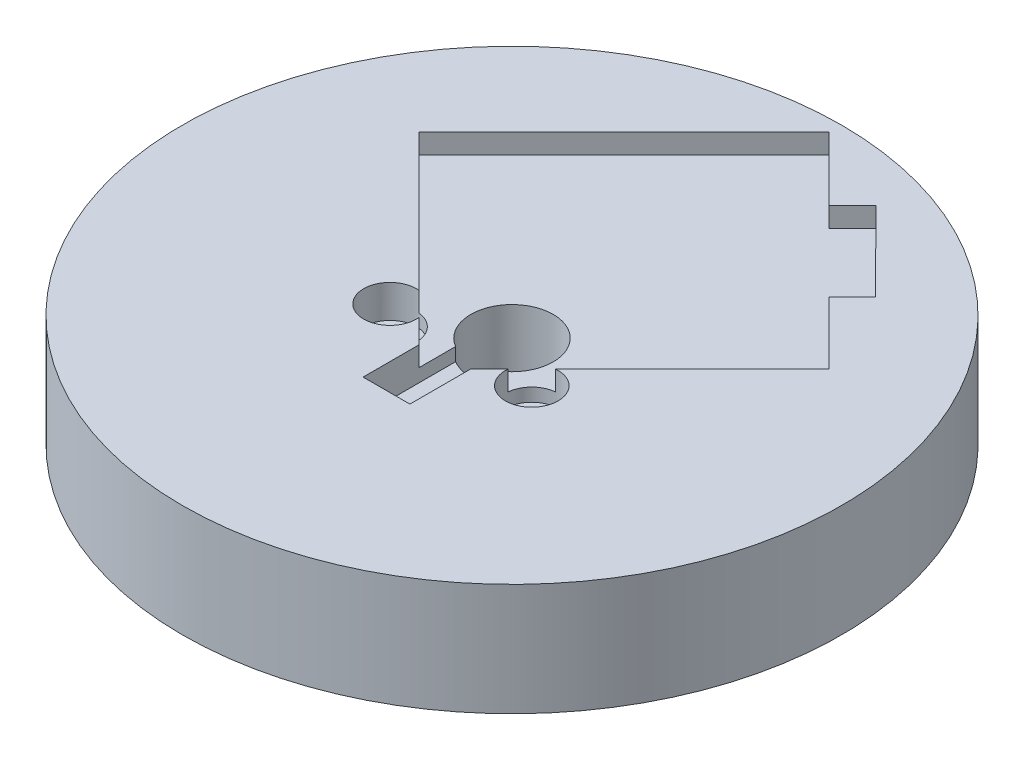
ISO-10303-21;
HEADER;
FILE_DESCRIPTION(('STEP AP214'),'2;1');
FILE_NAME('part.step','',(''),(''),'','','');
FILE_SCHEMA(('AUTOMOTIVE_DESIGN { 1 0 10303 214 1 1 1 1 }'));
ENDSEC;
DATA;
#1=APPLICATION_CONTEXT('core data for automotive mechanical design processes');
#2=APPLICATION_PROTOCOL_DEFINITION('international standard','automotive_design',2000,#1);
#3=PRODUCT_CONTEXT('',#1,'mechanical');
#4=PRODUCT('Part','Part','',(#3));
#5=PRODUCT_RELATED_PRODUCT_CATEGORY('part','',(#4));
#6=PRODUCT_DEFINITION_FORMATION('','',#4);
#7=PRODUCT_DEFINITION_CONTEXT('part definition',#1,'design');
#8=PRODUCT_DEFINITION('design','',#6,#7);
#9=PRODUCT_DEFINITION_SHAPE('','',#8);
#10=(LENGTH_UNIT() NAMED_UNIT(*) SI_UNIT(.MILLI.,.METRE.));
#11=(NAMED_UNIT(*) PLANE_ANGLE_UNIT() SI_UNIT($,.RADIAN.));
#12=(NAMED_UNIT(*) SI_UNIT($,.STERADIAN.) SOLID_ANGLE_UNIT());
#13=UNCERTAINTY_MEASURE_WITH_UNIT(LENGTH_MEASURE(1.E-05),#10,'distance_accuracy_value','');
#14=(GEOMETRIC_REPRESENTATION_CONTEXT(3) GLOBAL_UNCERTAINTY_ASSIGNED_CONTEXT((#13)) GLOBAL_UNIT_ASSIGNED_CONTEXT((#10,
#11,#12)) REPRESENTATION_CONTEXT('',''));
#15=CARTESIAN_POINT('',(0.,0.,0.));
#16=DIRECTION('',(0.,0.,1.));
#17=DIRECTION('',(1.,0.,0.));
#18=AXIS2_PLACEMENT_3D('',#15,#16,#17);
#19=CARTESIAN_POINT('',(-8.37220807518578E-06,14.,-48.1126983722553));
#20=DIRECTION('',(0.707106781186547,0.,-0.707106781186548));
#21=DIRECTION('',(-0.707106781186548,0.,-0.707106781186547));
#22=AXIS2_PLACEMENT_3D('',#19,#20,#21);
#23=PLANE('',#22);
#24=DIRECTION('',(-0.707106781186548,0.,-0.707106781186547));
#25=VECTOR('',#24,1.);
#26=CARTESIAN_POINT('',(-8.37220807518578E-06,14.,-48.1126983722553));
#27=LINE('',#26,#25);
#28=CARTESIAN_POINT('',(9.62982802256599,14.,-38.4828619774813));
#29=VERTEX_POINT('',#28);
#30=CARTESIAN_POINT('',(-8.37220807518578E-06,14.,-48.1126983722553));
#31=VERTEX_POINT('',#30);
#32=EDGE_CURVE('E196',#29,#31,#27,.T.);
#33=ORIENTED_EDGE('',*,*,#32,.F.);
#34=DIRECTION('',(0.,1.,0.));
#35=VECTOR('',#34,1.);
#36=CARTESIAN_POINT('',(9.62982802256598,14.,-38.4828619774813));
#37=LINE('',#36,#35);
#38=CARTESIAN_POINT('',(9.62982802256598,17.,-38.4828619774813));
#39=VERTEX_POINT('',#38);
#40=EDGE_CURVE('E11',#29,#39,#37,.T.);
#41=ORIENTED_EDGE('',*,*,#40,.T.);
#42=DIRECTION('',(-0.707106781186548,0.,-0.707106781186547));
#43=VECTOR('',#42,1.);
#44=CARTESIAN_POINT('',(-8.37220807518578E-06,17.,-48.1126983722553));
#45=LINE('',#44,#43);
#46=CARTESIAN_POINT('',(-8.37220807518578E-06,17.,-48.1126983722553));
#47=VERTEX_POINT('',#46);
#48=EDGE_CURVE('E209',#39,#47,#45,.T.);
#49=ORIENTED_EDGE('',*,*,#48,.T.);
#50=DIRECTION('',(0.,1.,0.));
#51=VECTOR('',#50,1.);
#52=CARTESIAN_POINT('',(-8.37220807518578E-06,14.,-48.1126983722553));
#53=LINE('',#52,#51);
#54=EDGE_CURVE('E214',#31,#47,#53,.T.);
#55=ORIENTED_EDGE('',*,*,#54,.F.);
#56=EDGE_LOOP('',(#33,#41,#49,#55));
#57=FACE_BOUND('',#56,.T.);
#58=ADVANCED_FACE('F33',(#57),#23,.F.);
#59=CARTESIAN_POINT('',(0.,0.,0.));
#60=DIRECTION('',(0.,1.,0.));
#61=DIRECTION('',(0.,0.,1.));
#62=AXIS2_PLACEMENT_3D('',#59,#60,#61);
#63=CYLINDRICAL_SURFACE('',#62,6.25);
#64=CARTESIAN_POINT('',(0.,0.,0.));
#65=DIRECTION('',(0.,1.,0.));
#66=DIRECTION('',(0.,0.,1.));
#67=AXIS2_PLACEMENT_3D('',#64,#65,#66);
#68=CIRCLE('',#67,6.25);
#69=CARTESIAN_POINT('',(0.,0.,6.25));
#70=VERTEX_POINT('',#69);
#71=EDGE_CURVE('E279',#70,#70,#68,.T.);
#72=ORIENTED_EDGE('',*,*,#71,.F.);
#73=EDGE_LOOP('',(#72));
#74=FACE_BOUND('',#73,.T.);
#75=CARTESIAN_POINT('',(0.,14.,0.));
#76=DIRECTION('',(0.,1.,0.));
#77=DIRECTION('',(0.,0.,1.));
#78=AXIS2_PLACEMENT_3D('',#75,#76,#77);
#79=CIRCLE('',#78,6.25);
#80=CARTESIAN_POINT('',(-3.17955820079156,14.,5.38079080133944));
#81=VERTEX_POINT('',#80);
#82=CARTESIAN_POINT('',(3.17955820079156,14.,5.38079080133944));
#83=VERTEX_POINT('',#82);
#84=EDGE_CURVE('E220',#81,#83,#79,.F.);
#85=ORIENTED_EDGE('',*,*,#84,.F.);
#86=DIRECTION('',(0.,1.,0.));
#87=VECTOR('',#86,1.);
#88=CARTESIAN_POINT('',(-3.17955820079156,12.,5.38079080133944));
#89=LINE('',#88,#87);
#90=CARTESIAN_POINT('',(-3.17955820079156,12.,5.38079080133944));
#91=VERTEX_POINT('',#90);
#92=EDGE_CURVE('E259',#91,#81,#89,.T.);
#93=ORIENTED_EDGE('',*,*,#92,.F.);
#94=CARTESIAN_POINT('',(0.,12.,0.));
#95=DIRECTION('',(0.,1.,0.));
#96=DIRECTION('',(0.,0.,1.));
#97=AXIS2_PLACEMENT_3D('',#94,#95,#96);
#98=CIRCLE('',#97,6.25);
#99=CARTESIAN_POINT('',(3.17955820079156,12.,5.38079080133944));
#100=VERTEX_POINT('',#99);
#101=EDGE_CURVE('E288',#100,#91,#98,.F.);
#102=ORIENTED_EDGE('',*,*,#101,.F.);
#103=DIRECTION('',(0.,1.,0.));
#104=VECTOR('',#103,1.);
#105=CARTESIAN_POINT('',(3.17955820079156,0.,5.38079080133944));
#106=LINE('',#105,#104);
#107=EDGE_CURVE('E292',#100,#83,#106,.T.);
#108=ORIENTED_EDGE('',*,*,#107,.T.);
#109=EDGE_LOOP('',(#85,#93,#102,#108));
#110=FACE_BOUND('',#109,.T.);
#111=ADVANCED_FACE('F372',(#74,#110),#63,.F.);
#112=CARTESIAN_POINT('',(-3.17955820079156,12.,5.38079080133944));
#113=DIRECTION('',(0.,0.,-1.));
#114=DIRECTION('',(-1.,0.,0.));
#115=AXIS2_PLACEMENT_3D('',#112,#113,#114);
#116=PLANE('',#115);
#117=DIRECTION('',(1.,0.,0.));
#118=VECTOR('',#117,1.);
#119=CARTESIAN_POINT('',(-3.17955820079156,14.,5.38079080133944));
#120=LINE('',#119,#118);
#121=CARTESIAN_POINT('',(3.91991652847562,14.,5.38079080133944));
#122=VERTEX_POINT('',#121);
#123=EDGE_CURVE('E55',#83,#122,#120,.T.);
#124=ORIENTED_EDGE('',*,*,#123,.F.);
#125=ORIENTED_EDGE('',*,*,#107,.F.);
#126=DIRECTION('',(-1.,0.,0.));
#127=VECTOR('',#126,1.);
#128=CARTESIAN_POINT('',(-3.17955820079156,12.,5.38079080133944));
#129=LINE('',#128,#127);
#130=CARTESIAN_POINT('',(3.91991652847562,12.,5.38079080133944));
#131=VERTEX_POINT('',#130);
#132=EDGE_CURVE('E250',#131,#100,#129,.T.);
#133=ORIENTED_EDGE('',*,*,#132,.F.);
#134=DIRECTION('',(0.,1.,0.));
#135=VECTOR('',#134,1.);
#136=CARTESIAN_POINT('',(3.91991652847562,12.,5.38079080133944));
#137=LINE('',#136,#135);
#138=EDGE_CURVE('E263',#131,#122,#137,.T.);
#139=ORIENTED_EDGE('',*,*,#138,.T.);
#140=EDGE_LOOP('',(#124,#125,#133,#139));
#141=FACE_BOUND('',#140,.T.);
#142=ADVANCED_FACE('F376',(#141),#116,.F.);
#143=CARTESIAN_POINT('',(0.,17.,0.));
#144=DIRECTION('',(0.,-1.,0.));
#145=DIRECTION('',(0.,0.,-1.));
#146=AXIS2_PLACEMENT_3D('',#143,#144,#145);
#147=CYLINDRICAL_SURFACE('',#146,50.);
#148=CARTESIAN_POINT('',(0.,17.,0.));
#149=DIRECTION('',(0.,1.,0.));
#150=DIRECTION('',(0.,0.,1.));
#151=AXIS2_PLACEMENT_3D('',#148,#149,#150);
#152=CIRCLE('',#151,50.);
#153=CARTESIAN_POINT('',(0.,17.,50.));
#154=VERTEX_POINT('',#153);
#155=EDGE_CURVE('E285',#154,#154,#152,.T.);
#156=ORIENTED_EDGE('',*,*,#155,.F.);
#157=EDGE_LOOP('',(#156));
#158=FACE_BOUND('',#157,.T.);
#159=CARTESIAN_POINT('',(0.,0.,0.));
#160=DIRECTION('',(0.,1.,0.));
#161=DIRECTION('',(0.,0.,1.));
#162=AXIS2_PLACEMENT_3D('',#159,#160,#161);
#163=CIRCLE('',#162,50.);
#164=CARTESIAN_POINT('',(0.,0.,50.));
#165=VERTEX_POINT('',#164);
#166=EDGE_CURVE('E284',#165,#165,#163,.T.);
#167=ORIENTED_EDGE('',*,*,#166,.T.);
#168=EDGE_LOOP('',(#167));
#169=FACE_BOUND('',#168,.T.);
#170=ADVANCED_FACE('F35',(#158,#169),#147,.T.);
#171=CARTESIAN_POINT('',(0.,17.,0.));
#172=DIRECTION('',(0.,1.,0.));
#173=DIRECTION('',(0.,0.,1.));
#174=AXIS2_PLACEMENT_3D('',#171,#172,#173);
#175=PLANE('',#174);
#176=DIRECTION('',(-0.710913616291802,0.,0.70327934007115));
#177=VECTOR('',#176,1.);
#178=CARTESIAN_POINT('',(-5.97787439060478,17.,-23.0427657384803));
#179=LINE('',#178,#177);
#180=CARTESIAN_POINT('',(13.2167932492739,17.,-42.0313079204014));
#181=VERTEX_POINT('',#180);
#182=EDGE_CURVE('E180',#181,#39,#179,.T.);
#183=ORIENTED_EDGE('',*,*,#182,.F.);
#184=DIRECTION('',(-0.703279340071151,0.,-0.710913616291801));
#185=VECTOR('',#184,1.);
#186=CARTESIAN_POINT('',(13.2167932492739,17.,-42.0313079204014));
#187=LINE('',#186,#185);
#188=CARTESIAN_POINT('',(25.1725420304834,17.,-29.9457764434408));
#189=VERTEX_POINT('',#188);
#190=EDGE_CURVE('E183',#189,#181,#187,.T.);
#191=ORIENTED_EDGE('',*,*,#190,.F.);
#192=DIRECTION('',(0.710913616291801,0.,-0.703279340071151));
#193=VECTOR('',#192,1.);
#194=CARTESIAN_POINT('',(5.97787439060478,17.,-10.9572342615197));
#195=LINE('',#194,#193);
#196=CARTESIAN_POINT('',(21.6508184563756,17.,-26.4618715436717));
#197=VERTEX_POINT('',#196);
#198=EDGE_CURVE('E170',#197,#189,#195,.T.);
#199=ORIENTED_EDGE('',*,*,#198,.F.);
#200=CARTESIAN_POINT('',(31.11269,17.,-17.0000000000473));
#201=VERTEX_POINT('',#200);
#202=EDGE_CURVE('E205',#201,#197,#45,.T.);
#203=ORIENTED_EDGE('',*,*,#202,.F.);
#204=DIRECTION('',(0.707106781186548,0.,-0.707106781186548));
#205=VECTOR('',#204,1.);
#206=CARTESIAN_POINT('',(-8.37220807765607E-06,17.,14.1126983721608));
#207=LINE('',#206,#205);
#208=CARTESIAN_POINT('',(10.3418078925819,17.,3.77088210737083));
#209=VERTEX_POINT('',#208);
#210=EDGE_CURVE('E202',#209,#201,#207,.T.);
#211=ORIENTED_EDGE('',*,*,#210,.F.);
#212=CARTESIAN_POINT('',(10.75,17.,7.75));
#213=DIRECTION('',(0.,-1.,0.));
#214=DIRECTION('',(0.,0.,1.));
#215=AXIS2_PLACEMENT_3D('',#212,#213,#214);
#216=CIRCLE('',#215,4.);
#217=CARTESIAN_POINT('',(6.77088210737083,17.,7.34180789258192));
#218=VERTEX_POINT('',#217);
#219=EDGE_CURVE('E262',#209,#218,#216,.T.);
#220=ORIENTED_EDGE('',*,*,#219,.T.);
#221=CARTESIAN_POINT('',(3.91991652847562,17.,10.1927734714771));
#222=VERTEX_POINT('',#221);
#223=EDGE_CURVE('E204',#222,#218,#207,.T.);
#224=ORIENTED_EDGE('',*,*,#223,.F.);
#225=DIRECTION('',(0.,0.,-1.));
#226=VECTOR('',#225,1.);
#227=CARTESIAN_POINT('',(3.91991652847562,17.,5.38079080133944));
#228=LINE('',#227,#226);
#229=CARTESIAN_POINT('',(3.91991652847562,17.,19.4129199505457));
#230=VERTEX_POINT('',#229);
#231=EDGE_CURVE('E244',#230,#222,#228,.T.);
#232=ORIENTED_EDGE('',*,*,#231,.F.);
#233=DIRECTION('',(1.,0.,0.));
#234=VECTOR('',#233,1.);
#235=CARTESIAN_POINT('',(-3.17955820079156,17.,19.4129199505457));
#236=LINE('',#235,#234);
#237=CARTESIAN_POINT('',(-3.17955820079156,17.,19.4129199505457));
#238=VERTEX_POINT('',#237);
#239=EDGE_CURVE('E254',#238,#230,#236,.T.);
#240=ORIENTED_EDGE('',*,*,#239,.F.);
#241=DIRECTION('',(0.,0.,1.));
#242=VECTOR('',#241,1.);
#243=CARTESIAN_POINT('',(-3.17955820079156,17.,5.38079080133944));
#244=LINE('',#243,#242);
#245=CARTESIAN_POINT('',(-3.17955820079157,17.,10.9331485435773));
#246=VERTEX_POINT('',#245);
#247=EDGE_CURVE('E239',#246,#238,#244,.T.);
#248=ORIENTED_EDGE('',*,*,#247,.F.);
#249=DIRECTION('',(0.707106781186548,0.,0.707106781186548));
#250=VECTOR('',#249,1.);
#251=CARTESIAN_POINT('',(-31.1127067444162,17.,-17.0000000000473));
#252=LINE('',#251,#250);
#253=CARTESIAN_POINT('',(-6.77088019336785,17.,7.34182655100106));
#254=VERTEX_POINT('',#253);
#255=EDGE_CURVE('E185',#254,#246,#252,.T.);
#256=ORIENTED_EDGE('',*,*,#255,.F.);
#257=CARTESIAN_POINT('',(-10.75,17.,7.75));
#258=DIRECTION('',(0.,1.,0.));
#259=DIRECTION('',(0.,0.,1.));
#260=AXIS2_PLACEMENT_3D('',#257,#258,#259);
#261=CIRCLE('',#260,4.);
#262=CARTESIAN_POINT('',(-10.3418265510011,17.,3.77088019336784));
#263=VERTEX_POINT('',#262);
#264=EDGE_CURVE('E273',#263,#254,#261,.T.);
#265=ORIENTED_EDGE('',*,*,#264,.F.);
#266=CARTESIAN_POINT('',(-31.1127067444162,17.,-17.0000000000473));
#267=VERTEX_POINT('',#266);
#268=EDGE_CURVE('E200',#267,#263,#252,.T.);
#269=ORIENTED_EDGE('',*,*,#268,.F.);
#270=DIRECTION('',(-0.707106781186548,0.,0.707106781186548));
#271=VECTOR('',#270,1.);
#272=CARTESIAN_POINT('',(-31.1127067444162,17.,-17.0000000000473));
#273=LINE('',#272,#271);
#274=EDGE_CURVE('E208',#47,#267,#273,.T.);
#275=ORIENTED_EDGE('',*,*,#274,.F.);
#276=ORIENTED_EDGE('',*,*,#48,.F.);
#277=EDGE_LOOP('',(#183,#191,#199,#203,#211,#220,#224,#232,#240,#248,#256,#265,#269,#275,#276));
#278=FACE_BOUND('',#277,.T.);
#279=ORIENTED_EDGE('',*,*,#155,.T.);
#280=EDGE_LOOP('',(#279));
#281=FACE_BOUND('',#280,.T.);
#282=ADVANCED_FACE('F307',(#278,#281),#175,.T.);
#283=CARTESIAN_POINT('',(0.,0.,0.));
#284=DIRECTION('',(0.,1.,0.));
#285=DIRECTION('',(0.,0.,1.));
#286=AXIS2_PLACEMENT_3D('',#283,#284,#285);
#287=PLANE('',#286);
#288=ORIENTED_EDGE('',*,*,#71,.T.);
#289=EDGE_LOOP('',(#288));
#290=FACE_BOUND('',#289,.T.);
#291=ORIENTED_EDGE('',*,*,#166,.F.);
#292=EDGE_LOOP('',(#291));
#293=FACE_BOUND('',#292,.T.);
#294=ADVANCED_FACE('F408',(#290,#293),#287,.F.);
#295=CARTESIAN_POINT('',(-10.75,12.,7.75));
#296=DIRECTION('',(0.,1.,0.));
#297=DIRECTION('',(0.,0.,1.));
#298=AXIS2_PLACEMENT_3D('',#295,#296,#297);
#299=CYLINDRICAL_SURFACE('',#298,4.);
#300=ORIENTED_EDGE('',*,*,#264,.T.);
#301=DIRECTION('',(0.,1.,0.));
#302=VECTOR('',#301,1.);
#303=CARTESIAN_POINT('',(-6.77088019336784,12.,7.34182655100106));
#304=LINE('',#303,#302);
#305=CARTESIAN_POINT('',(-6.77088019336785,14.,7.34182655100106));
#306=VERTEX_POINT('',#305);
#307=EDGE_CURVE('E236',#254,#306,#304,.F.);
#308=ORIENTED_EDGE('',*,*,#307,.T.);
#309=CARTESIAN_POINT('',(-10.75,14.,7.75));
#310=DIRECTION('',(0.,1.,0.));
#311=DIRECTION('',(0.,0.,1.));
#312=AXIS2_PLACEMENT_3D('',#309,#310,#311);
#313=CIRCLE('',#312,4.);
#314=CARTESIAN_POINT('',(-10.3418265510011,14.,3.77088019336784));
#315=VERTEX_POINT('',#314);
#316=EDGE_CURVE('E227',#315,#306,#313,.F.);
#317=ORIENTED_EDGE('',*,*,#316,.F.);
#318=DIRECTION('',(0.,1.,0.));
#319=VECTOR('',#318,1.);
#320=CARTESIAN_POINT('',(-10.3418265510011,12.,3.77088019336785));
#321=LINE('',#320,#319);
#322=EDGE_CURVE('E233',#315,#263,#321,.T.);
#323=ORIENTED_EDGE('',*,*,#322,.T.);
#324=EDGE_LOOP('',(#300,#308,#317,#323));
#325=FACE_BOUND('',#324,.T.);
#326=CARTESIAN_POINT('',(-10.75,12.,7.75));
#327=DIRECTION('',(0.,1.,0.));
#328=DIRECTION('',(0.,0.,1.));
#329=AXIS2_PLACEMENT_3D('',#326,#327,#328);
#330=CIRCLE('',#329,4.);
#331=CARTESIAN_POINT('',(-10.75,12.,11.75));
#332=VERTEX_POINT('',#331);
#333=EDGE_CURVE('E276',#332,#332,#330,.T.);
#334=ORIENTED_EDGE('',*,*,#333,.F.);
#335=EDGE_LOOP('',(#334));
#336=FACE_BOUND('',#335,.T.);
#337=ADVANCED_FACE('F355',(#325,#336),#299,.F.);
#338=CARTESIAN_POINT('',(-10.75,12.,7.75));
#339=DIRECTION('',(0.,1.,0.));
#340=DIRECTION('',(0.,0.,1.));
#341=AXIS2_PLACEMENT_3D('',#338,#339,#340);
#342=PLANE('',#341);
#343=ORIENTED_EDGE('',*,*,#333,.T.);
#344=EDGE_LOOP('',(#343));
#345=FACE_BOUND('',#344,.T.);
#346=ADVANCED_FACE('F403',(#345),#342,.T.);
#347=CARTESIAN_POINT('',(10.75,12.,7.75));
#348=DIRECTION('',(0.,1.,0.));
#349=DIRECTION('',(0.,0.,1.));
#350=AXIS2_PLACEMENT_3D('',#347,#348,#349);
#351=CYLINDRICAL_SURFACE('',#350,4.);
#352=DIRECTION('',(0.,1.,0.));
#353=VECTOR('',#352,1.);
#354=CARTESIAN_POINT('',(10.3418078925819,12.,3.77088210737083));
#355=LINE('',#354,#353);
#356=CARTESIAN_POINT('',(10.3418078925819,14.,3.77088210737083));
#357=VERTEX_POINT('',#356);
#358=EDGE_CURVE('E231',#357,#209,#355,.T.);
#359=ORIENTED_EDGE('',*,*,#358,.F.);
#360=CARTESIAN_POINT('',(10.75,14.,7.75));
#361=DIRECTION('',(0.,1.,0.));
#362=DIRECTION('',(0.,0.,1.));
#363=AXIS2_PLACEMENT_3D('',#360,#361,#362);
#364=CIRCLE('',#363,4.);
#365=CARTESIAN_POINT('',(6.77088210737083,14.,7.34180789258192));
#366=VERTEX_POINT('',#365);
#367=EDGE_CURVE('E224',#357,#366,#364,.T.);
#368=ORIENTED_EDGE('',*,*,#367,.T.);
#369=DIRECTION('',(0.,1.,0.));
#370=VECTOR('',#369,1.);
#371=CARTESIAN_POINT('',(6.77088210737083,12.,7.34180789258192));
#372=LINE('',#371,#370);
#373=EDGE_CURVE('E229',#218,#366,#372,.F.);
#374=ORIENTED_EDGE('',*,*,#373,.F.);
#375=ORIENTED_EDGE('',*,*,#219,.F.);
#376=EDGE_LOOP('',(#359,#368,#374,#375));
#377=FACE_BOUND('',#376,.T.);
#378=CARTESIAN_POINT('',(10.75,12.,7.75));
#379=DIRECTION('',(0.,-1.,0.));
#380=DIRECTION('',(0.,0.,1.));
#381=AXIS2_PLACEMENT_3D('',#378,#379,#380);
#382=CIRCLE('',#381,4.);
#383=CARTESIAN_POINT('',(10.75,12.,11.75));
#384=VERTEX_POINT('',#383);
#385=EDGE_CURVE('E270',#384,#384,#382,.T.);
#386=ORIENTED_EDGE('',*,*,#385,.T.);
#387=EDGE_LOOP('',(#386));
#388=FACE_BOUND('',#387,.T.);
#389=ADVANCED_FACE('F325',(#377,#388),#351,.F.);
#390=CARTESIAN_POINT('',(10.75,12.,7.75));
#391=DIRECTION('',(0.,1.,0.));
#392=DIRECTION('',(0.,0.,1.));
#393=AXIS2_PLACEMENT_3D('',#390,#391,#392);
#394=PLANE('',#393);
#395=ORIENTED_EDGE('',*,*,#385,.F.);
#396=EDGE_LOOP('',(#395));
#397=FACE_BOUND('',#396,.T.);
#398=ADVANCED_FACE('F387',(#397),#394,.T.);
#399=CARTESIAN_POINT('',(0.,12.,0.));
#400=DIRECTION('',(0.,1.,0.));
#401=DIRECTION('',(0.,0.,1.));
#402=AXIS2_PLACEMENT_3D('',#399,#400,#401);
#403=PLANE('',#402);
#404=ORIENTED_EDGE('',*,*,#101,.T.);
#405=DIRECTION('',(0.,0.,1.));
#406=VECTOR('',#405,1.);
#407=CARTESIAN_POINT('',(-3.17955820079156,12.,5.38079080133944));
#408=LINE('',#407,#406);
#409=CARTESIAN_POINT('',(-3.17955820079156,12.,19.4129199505457));
#410=VERTEX_POINT('',#409);
#411=EDGE_CURVE('E240',#91,#410,#408,.T.);
#412=ORIENTED_EDGE('',*,*,#411,.T.);
#413=DIRECTION('',(1.,0.,0.));
#414=VECTOR('',#413,1.);
#415=CARTESIAN_POINT('',(-3.17955820079156,12.,19.4129199505457));
#416=LINE('',#415,#414);
#417=CARTESIAN_POINT('',(3.91991652847562,12.,19.4129199505457));
#418=VERTEX_POINT('',#417);
#419=EDGE_CURVE('E243',#410,#418,#416,.T.);
#420=ORIENTED_EDGE('',*,*,#419,.T.);
#421=DIRECTION('',(0.,0.,-1.));
#422=VECTOR('',#421,1.);
#423=CARTESIAN_POINT('',(3.91991652847562,12.,5.38079080133944));
#424=LINE('',#423,#422);
#425=EDGE_CURVE('E247',#418,#131,#424,.T.);
#426=ORIENTED_EDGE('',*,*,#425,.T.);
#427=ORIENTED_EDGE('',*,*,#132,.T.);
#428=EDGE_LOOP('',(#404,#412,#420,#426,#427));
#429=FACE_BOUND('',#428,.T.);
#430=ADVANCED_FACE('F384',(#429),#403,.T.);
#431=CARTESIAN_POINT('',(-3.17955820079156,12.,5.38079080133944));
#432=DIRECTION('',(-1.,0.,0.));
#433=DIRECTION('',(0.,0.,1.));
#434=AXIS2_PLACEMENT_3D('',#431,#432,#433);
#435=PLANE('',#434);
#436=DIRECTION('',(0.,0.,-1.));
#437=VECTOR('',#436,1.);
#438=CARTESIAN_POINT('',(-3.17955820079156,14.,5.38079080133944));
#439=LINE('',#438,#437);
#440=CARTESIAN_POINT('',(-3.17955820079157,14.,10.9331485435773));
#441=VERTEX_POINT('',#440);
#442=EDGE_CURVE('E222',#441,#81,#439,.T.);
#443=ORIENTED_EDGE('',*,*,#442,.F.);
#444=DIRECTION('',(0.,1.,0.));
#445=VECTOR('',#444,1.);
#446=CARTESIAN_POINT('',(-3.17955820079156,12.,10.9331485435773));
#447=LINE('',#446,#445);
#448=EDGE_CURVE('E300',#441,#246,#447,.T.);
#449=ORIENTED_EDGE('',*,*,#448,.T.);
#450=ORIENTED_EDGE('',*,*,#247,.T.);
#451=DIRECTION('',(0.,1.,0.));
#452=VECTOR('',#451,1.);
#453=CARTESIAN_POINT('',(-3.17955820079156,12.,19.4129199505457));
#454=LINE('',#453,#452);
#455=EDGE_CURVE('E252',#410,#238,#454,.T.);
#456=ORIENTED_EDGE('',*,*,#455,.F.);
#457=ORIENTED_EDGE('',*,*,#411,.F.);
#458=ORIENTED_EDGE('',*,*,#92,.T.);
#459=EDGE_LOOP('',(#443,#449,#450,#456,#457,#458));
#460=FACE_BOUND('',#459,.T.);
#461=ADVANCED_FACE('F345',(#460),#435,.F.);
#462=CARTESIAN_POINT('',(3.91991652847562,12.,5.38079080133944));
#463=DIRECTION('',(1.,0.,0.));
#464=DIRECTION('',(0.,0.,-1.));
#465=AXIS2_PLACEMENT_3D('',#462,#463,#464);
#466=PLANE('',#465);
#467=ORIENTED_EDGE('',*,*,#231,.T.);
#468=DIRECTION('',(0.,-1.,0.));
#469=VECTOR('',#468,1.);
#470=CARTESIAN_POINT('',(3.91991652847562,12.,10.1927734714771));
#471=LINE('',#470,#469);
#472=CARTESIAN_POINT('',(3.91991652847562,14.,10.1927734714771));
#473=VERTEX_POINT('',#472);
#474=EDGE_CURVE('E297',#222,#473,#471,.T.);
#475=ORIENTED_EDGE('',*,*,#474,.T.);
#476=DIRECTION('',(0.,0.,1.));
#477=VECTOR('',#476,1.);
#478=CARTESIAN_POINT('',(3.91991652847562,14.,5.38079080133944));
#479=LINE('',#478,#477);
#480=EDGE_CURVE('E295',#122,#473,#479,.T.);
#481=ORIENTED_EDGE('',*,*,#480,.F.);
#482=ORIENTED_EDGE('',*,*,#138,.F.);
#483=ORIENTED_EDGE('',*,*,#425,.F.);
#484=DIRECTION('',(0.,1.,0.));
#485=VECTOR('',#484,1.);
#486=CARTESIAN_POINT('',(3.91991652847562,12.,19.4129199505457));
#487=LINE('',#486,#485);
#488=EDGE_CURVE('E266',#418,#230,#487,.T.);
#489=ORIENTED_EDGE('',*,*,#488,.T.);
#490=EDGE_LOOP('',(#467,#475,#481,#482,#483,#489));
#491=FACE_BOUND('',#490,.T.);
#492=ADVANCED_FACE('F335',(#491),#466,.F.);
#493=CARTESIAN_POINT('',(-3.17955820079156,12.,19.4129199505457));
#494=DIRECTION('',(0.,0.,1.));
#495=DIRECTION('',(1.,0.,0.));
#496=AXIS2_PLACEMENT_3D('',#493,#494,#495);
#497=PLANE('',#496);
#498=ORIENTED_EDGE('',*,*,#239,.T.);
#499=ORIENTED_EDGE('',*,*,#488,.F.);
#500=ORIENTED_EDGE('',*,*,#419,.F.);
#501=ORIENTED_EDGE('',*,*,#455,.T.);
#502=EDGE_LOOP('',(#498,#499,#500,#501));
#503=FACE_BOUND('',#502,.T.);
#504=ADVANCED_FACE('F339',(#503),#497,.F.);
#505=CARTESIAN_POINT('',(-31.1127067444162,14.,-17.0000000000473));
#506=DIRECTION('',(-0.707106781186547,0.,0.707106781186548));
#507=DIRECTION('',(0.707106781186548,0.,0.707106781186547));
#508=AXIS2_PLACEMENT_3D('',#505,#506,#507);
#509=PLANE('',#508);
#510=ORIENTED_EDGE('',*,*,#255,.T.);
#511=ORIENTED_EDGE('',*,*,#448,.F.);
#512=DIRECTION('',(0.707106781186548,0.,0.707106781186548));
#513=VECTOR('',#512,1.);
#514=CARTESIAN_POINT('',(-31.1127067444162,14.,-17.0000000000473));
#515=LINE('',#514,#513);
#516=EDGE_CURVE('E191',#306,#441,#515,.T.);
#517=ORIENTED_EDGE('',*,*,#516,.F.);
#518=ORIENTED_EDGE('',*,*,#307,.F.);
#519=EDGE_LOOP('',(#510,#511,#517,#518));
#520=FACE_BOUND('',#519,.T.);
#521=ADVANCED_FACE('F350',(#520),#509,.F.);
#522=CARTESIAN_POINT('',(-31.1127067444162,14.,-17.0000000000473));
#523=VERTEX_POINT('',#522);
#524=EDGE_CURVE('E187',#523,#315,#515,.T.);
#525=ORIENTED_EDGE('',*,*,#524,.F.);
#526=DIRECTION('',(0.,1.,0.));
#527=VECTOR('',#526,1.);
#528=CARTESIAN_POINT('',(-31.1127067444162,14.,-17.0000000000473));
#529=LINE('',#528,#527);
#530=EDGE_CURVE('E212',#523,#267,#529,.T.);
#531=ORIENTED_EDGE('',*,*,#530,.T.);
#532=ORIENTED_EDGE('',*,*,#268,.T.);
#533=ORIENTED_EDGE('',*,*,#322,.F.);
#534=EDGE_LOOP('',(#525,#531,#532,#533));
#535=FACE_BOUND('',#534,.T.);
#536=ADVANCED_FACE('F359',(#535),#509,.F.);
#537=CARTESIAN_POINT('',(-8.37220807765607E-06,14.,14.1126983721608));
#538=DIRECTION('',(0.707106781186547,0.,0.707106781186548));
#539=DIRECTION('',(0.707106781186548,0.,-0.707106781186547));
#540=AXIS2_PLACEMENT_3D('',#537,#538,#539);
#541=PLANE('',#540);
#542=ORIENTED_EDGE('',*,*,#358,.T.);
#543=ORIENTED_EDGE('',*,*,#210,.T.);
#544=DIRECTION('',(0.,1.,0.));
#545=VECTOR('',#544,1.);
#546=CARTESIAN_POINT('',(31.11269,14.,-17.0000000000473));
#547=LINE('',#546,#545);
#548=CARTESIAN_POINT('',(31.11269,14.,-17.0000000000473));
#549=VERTEX_POINT('',#548);
#550=EDGE_CURVE('E199',#549,#201,#547,.T.);
#551=ORIENTED_EDGE('',*,*,#550,.F.);
#552=DIRECTION('',(0.707106781186548,0.,-0.707106781186548));
#553=VECTOR('',#552,1.);
#554=CARTESIAN_POINT('',(-8.37220807765607E-06,14.,14.1126983721608));
#555=LINE('',#554,#553);
#556=EDGE_CURVE('E190',#357,#549,#555,.T.);
#557=ORIENTED_EDGE('',*,*,#556,.F.);
#558=EDGE_LOOP('',(#542,#543,#551,#557));
#559=FACE_BOUND('',#558,.T.);
#560=ADVANCED_FACE('F329',(#559),#541,.F.);
#561=ORIENTED_EDGE('',*,*,#373,.T.);
#562=EDGE_CURVE('E193',#473,#366,#555,.T.);
#563=ORIENTED_EDGE('',*,*,#562,.F.);
#564=ORIENTED_EDGE('',*,*,#474,.F.);
#565=ORIENTED_EDGE('',*,*,#223,.T.);
#566=EDGE_LOOP('',(#561,#563,#564,#565));
#567=FACE_BOUND('',#566,.T.);
#568=ADVANCED_FACE('F369',(#567),#541,.F.);
#569=CARTESIAN_POINT('',(0.,14.,0.));
#570=DIRECTION('',(0.,1.,0.));
#571=DIRECTION('',(0.,0.,1.));
#572=AXIS2_PLACEMENT_3D('',#569,#570,#571);
#573=PLANE('',#572);
#574=CARTESIAN_POINT('',(21.6508184563756,14.,-26.4618715436717));
#575=VERTEX_POINT('',#574);
#576=EDGE_CURVE('E162',#549,#575,#27,.T.);
#577=ORIENTED_EDGE('',*,*,#576,.T.);
#578=DIRECTION('',(0.710913616291801,0.,-0.703279340071151));
#579=VECTOR('',#578,1.);
#580=CARTESIAN_POINT('',(5.97787439060478,14.,-10.9572342615197));
#581=LINE('',#580,#579);
#582=CARTESIAN_POINT('',(25.1725420304834,14.,-29.9457764434408));
#583=VERTEX_POINT('',#582);
#584=EDGE_CURVE('E156',#575,#583,#581,.T.);
#585=ORIENTED_EDGE('',*,*,#584,.T.);
#586=DIRECTION('',(-0.703279340071151,0.,-0.710913616291801));
#587=VECTOR('',#586,1.);
#588=CARTESIAN_POINT('',(13.2167932492739,14.,-42.0313079204014));
#589=LINE('',#588,#587);
#590=CARTESIAN_POINT('',(13.2167932492739,14.,-42.0313079204014));
#591=VERTEX_POINT('',#590);
#592=EDGE_CURVE('E160',#583,#591,#589,.T.);
#593=ORIENTED_EDGE('',*,*,#592,.T.);
#594=DIRECTION('',(-0.710913616291802,0.,0.70327934007115));
#595=VECTOR('',#594,1.);
#596=CARTESIAN_POINT('',(-5.97787439060478,14.,-23.0427657384803));
#597=LINE('',#596,#595);
#598=EDGE_CURVE('E48',#591,#29,#597,.T.);
#599=ORIENTED_EDGE('',*,*,#598,.T.);
#600=ORIENTED_EDGE('',*,*,#32,.T.);
#601=DIRECTION('',(-0.707106781186548,0.,0.707106781186548));
#602=VECTOR('',#601,1.);
#603=CARTESIAN_POINT('',(-31.1127067444162,14.,-17.0000000000473));
#604=LINE('',#603,#602);
#605=EDGE_CURVE('E195',#31,#523,#604,.T.);
#606=ORIENTED_EDGE('',*,*,#605,.T.);
#607=ORIENTED_EDGE('',*,*,#524,.T.);
#608=ORIENTED_EDGE('',*,*,#316,.T.);
#609=ORIENTED_EDGE('',*,*,#516,.T.);
#610=ORIENTED_EDGE('',*,*,#442,.T.);
#611=ORIENTED_EDGE('',*,*,#84,.T.);
#612=ORIENTED_EDGE('',*,*,#123,.T.);
#613=ORIENTED_EDGE('',*,*,#480,.T.);
#614=ORIENTED_EDGE('',*,*,#562,.T.);
#615=ORIENTED_EDGE('',*,*,#367,.F.);
#616=ORIENTED_EDGE('',*,*,#556,.T.);
#617=EDGE_LOOP('',(#577,#585,#593,#599,#600,#606,#607,#608,#609,#610,#611,#612,#613,#614,#615,#616));
#618=FACE_BOUND('',#617,.T.);
#619=ADVANCED_FACE('F158',(#618),#573,.T.);
#620=CARTESIAN_POINT('',(-31.1127067444162,14.,-17.0000000000473));
#621=DIRECTION('',(-0.707106781186547,0.,-0.707106781186548));
#622=DIRECTION('',(-0.707106781186548,0.,0.707106781186547));
#623=AXIS2_PLACEMENT_3D('',#620,#621,#622);
#624=PLANE('',#623);
#625=ORIENTED_EDGE('',*,*,#274,.T.);
#626=ORIENTED_EDGE('',*,*,#530,.F.);
#627=ORIENTED_EDGE('',*,*,#605,.F.);
#628=ORIENTED_EDGE('',*,*,#54,.T.);
#629=EDGE_LOOP('',(#625,#626,#627,#628));
#630=FACE_BOUND('',#629,.T.);
#631=ADVANCED_FACE('F361',(#630),#624,.F.);
#632=ORIENTED_EDGE('',*,*,#202,.T.);
#633=DIRECTION('',(0.,-1.,0.));
#634=VECTOR('',#633,1.);
#635=CARTESIAN_POINT('',(21.6508184563756,14.,-26.4618715436717));
#636=LINE('',#635,#634);
#637=EDGE_CURVE('E41',#197,#575,#636,.T.);
#638=ORIENTED_EDGE('',*,*,#637,.T.);
#639=ORIENTED_EDGE('',*,*,#576,.F.);
#640=ORIENTED_EDGE('',*,*,#550,.T.);
#641=EDGE_LOOP('',(#632,#638,#639,#640));
#642=FACE_BOUND('',#641,.T.);
#643=ADVANCED_FACE('F303',(#642),#23,.F.);
#644=CARTESIAN_POINT('',(-5.97787439060478,14.,-23.0427657384803));
#645=DIRECTION('',(-0.70327934007115,0.,-0.710913616291802));
#646=DIRECTION('',(-0.710913616291802,0.,0.70327934007115));
#647=AXIS2_PLACEMENT_3D('',#644,#645,#646);
#648=PLANE('',#647);
#649=ORIENTED_EDGE('',*,*,#598,.F.);
#650=DIRECTION('',(0.,1.,0.));
#651=VECTOR('',#650,1.);
#652=CARTESIAN_POINT('',(13.2167932492739,14.,-42.0313079204014));
#653=LINE('',#652,#651);
#654=EDGE_CURVE('E174',#591,#181,#653,.T.);
#655=ORIENTED_EDGE('',*,*,#654,.T.);
#656=ORIENTED_EDGE('',*,*,#182,.T.);
#657=ORIENTED_EDGE('',*,*,#40,.F.);
#658=EDGE_LOOP('',(#649,#655,#656,#657));
#659=FACE_BOUND('',#658,.T.);
#660=ADVANCED_FACE('F313',(#659),#648,.F.);
#661=CARTESIAN_POINT('',(5.97787439060478,14.,-10.9572342615197));
#662=DIRECTION('',(0.703279340071151,0.,0.710913616291801));
#663=DIRECTION('',(0.710913616291801,0.,-0.703279340071151));
#664=AXIS2_PLACEMENT_3D('',#661,#662,#663);
#665=PLANE('',#664);
#666=ORIENTED_EDGE('',*,*,#198,.T.);
#667=DIRECTION('',(0.,1.,0.));
#668=VECTOR('',#667,1.);
#669=CARTESIAN_POINT('',(25.1725420304834,14.,-29.9457764434408));
#670=LINE('',#669,#668);
#671=EDGE_CURVE('E167',#583,#189,#670,.T.);
#672=ORIENTED_EDGE('',*,*,#671,.F.);
#673=ORIENTED_EDGE('',*,*,#584,.F.);
#674=ORIENTED_EDGE('',*,*,#637,.F.);
#675=EDGE_LOOP('',(#666,#672,#673,#674));
#676=FACE_BOUND('',#675,.T.);
#677=ADVANCED_FACE('F168',(#676),#665,.F.);
#678=CARTESIAN_POINT('',(13.2167932492739,14.,-42.0313079204014));
#679=DIRECTION('',(0.710913616291801,0.,-0.703279340071151));
#680=DIRECTION('',(-0.703279340071151,0.,-0.710913616291801));
#681=AXIS2_PLACEMENT_3D('',#678,#679,#680);
#682=PLANE('',#681);
#683=ORIENTED_EDGE('',*,*,#190,.T.);
#684=ORIENTED_EDGE('',*,*,#654,.F.);
#685=ORIENTED_EDGE('',*,*,#592,.F.);
#686=ORIENTED_EDGE('',*,*,#671,.T.);
#687=EDGE_LOOP('',(#683,#684,#685,#686));
#688=FACE_BOUND('',#687,.T.);
#689=ADVANCED_FACE('F176',(#688),#682,.F.);
#690=CLOSED_SHELL('',(#58,#111,#142,#170,#282,#294,#337,#346,#389,#398,#430,#461,#492,#504,#521,
#536,#560,#568,#619,#631,#643,#660,#677,#689));
#691=MANIFOLD_SOLID_BREP('B2',#690);
#692=ADVANCED_BREP_SHAPE_REPRESENTATION('',(#18,#691),#14);
#693=SHAPE_DEFINITION_REPRESENTATION(#9,#692);
ENDSEC;
END-ISO-10303-21;
